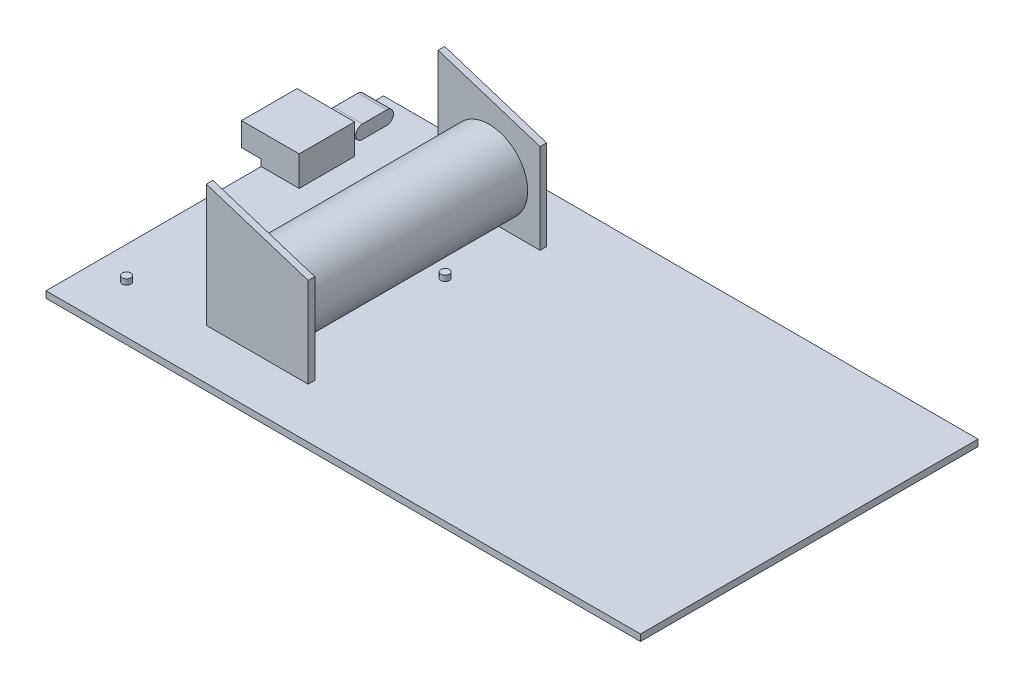
ISO-10303-21;
HEADER;
FILE_DESCRIPTION(('STEP AP214'),'2;1');
FILE_NAME('part.step','',(''),(''),'','','');
FILE_SCHEMA(('AUTOMOTIVE_DESIGN { 1 0 10303 214 1 1 1 1 }'));
ENDSEC;
DATA;
#1=APPLICATION_CONTEXT('core data for automotive mechanical design processes');
#2=APPLICATION_PROTOCOL_DEFINITION('international standard','automotive_design',2000,#1);
#3=PRODUCT_CONTEXT('',#1,'mechanical');
#4=PRODUCT('Part','Part','',(#3));
#5=PRODUCT_RELATED_PRODUCT_CATEGORY('part','',(#4));
#6=PRODUCT_DEFINITION_FORMATION('','',#4);
#7=PRODUCT_DEFINITION_CONTEXT('part definition',#1,'design');
#8=PRODUCT_DEFINITION('design','',#6,#7);
#9=PRODUCT_DEFINITION_SHAPE('','',#8);
#10=(LENGTH_UNIT() NAMED_UNIT(*) SI_UNIT(.MILLI.,.METRE.));
#11=(NAMED_UNIT(*) PLANE_ANGLE_UNIT() SI_UNIT($,.RADIAN.));
#12=(NAMED_UNIT(*) SI_UNIT($,.STERADIAN.) SOLID_ANGLE_UNIT());
#13=UNCERTAINTY_MEASURE_WITH_UNIT(LENGTH_MEASURE(1.E-05),#10,'distance_accuracy_value','');
#14=(GEOMETRIC_REPRESENTATION_CONTEXT(3) GLOBAL_UNCERTAINTY_ASSIGNED_CONTEXT((#13)) GLOBAL_UNIT_ASSIGNED_CONTEXT((#10,
#11,#12)) REPRESENTATION_CONTEXT('',''));
#15=CARTESIAN_POINT('',(0.,0.,0.));
#16=DIRECTION('',(0.,0.,1.));
#17=DIRECTION('',(1.,0.,0.));
#18=AXIS2_PLACEMENT_3D('',#15,#16,#17);
#19=CARTESIAN_POINT('',(0.,1.55,0.));
#20=DIRECTION('',(0.,-1.,0.));
#21=DIRECTION('',(0.,0.,-1.));
#22=AXIS2_PLACEMENT_3D('',#19,#20,#21);
#23=PLANE('',#22);
#24=CARTESIAN_POINT('',(-25.75,1.55,-9.9));
#25=DIRECTION('',(0.,-1.,0.));
#26=DIRECTION('',(0.,0.,-1.));
#27=AXIS2_PLACEMENT_3D('',#24,#25,#26);
#28=CIRCLE('',#27,0.999999999999998);
#29=CARTESIAN_POINT('',(-25.75,1.55,-10.9));
#30=VERTEX_POINT('',#29);
#31=EDGE_CURVE('E13',#30,#30,#28,.F.);
#32=ORIENTED_EDGE('',*,*,#31,.F.);
#33=EDGE_LOOP('',(#32));
#34=FACE_BOUND('',#33,.T.);
#35=CARTESIAN_POINT('',(-62.75,1.55,28.6));
#36=DIRECTION('',(0.,-1.,0.));
#37=DIRECTION('',(0.,0.,-1.));
#38=AXIS2_PLACEMENT_3D('',#35,#36,#37);
#39=CIRCLE('',#38,0.999999999999998);
#40=CARTESIAN_POINT('',(-62.75,1.55,27.6));
#41=VERTEX_POINT('',#40);
#42=EDGE_CURVE('E74',#41,#41,#39,.F.);
#43=ORIENTED_EDGE('',*,*,#42,.F.);
#44=EDGE_LOOP('',(#43));
#45=FACE_BOUND('',#44,.T.);
#46=DIRECTION('',(0.,0.,1.));
#47=VECTOR('',#46,1.);
#48=CARTESIAN_POINT('',(-44.35,1.55,-26.85));
#49=LINE('',#48,#47);
#50=CARTESIAN_POINT('',(-44.35,1.55,-28.4));
#51=VERTEX_POINT('',#50);
#52=CARTESIAN_POINT('',(-44.35,1.55,-26.85));
#53=VERTEX_POINT('',#52);
#54=EDGE_CURVE('E247',#51,#53,#49,.T.);
#55=ORIENTED_EDGE('',*,*,#54,.F.);
#56=DIRECTION('',(-1.,0.,0.));
#57=VECTOR('',#56,1.);
#58=CARTESIAN_POINT('',(-44.35,1.55,-28.4));
#59=LINE('',#58,#57);
#60=CARTESIAN_POINT('',(-20.2,1.55,-28.4));
#61=VERTEX_POINT('',#60);
#62=EDGE_CURVE('E261',#61,#51,#59,.T.);
#63=ORIENTED_EDGE('',*,*,#62,.F.);
#64=DIRECTION('',(0.,0.,-1.));
#65=VECTOR('',#64,1.);
#66=CARTESIAN_POINT('',(-20.2,1.55,-26.85));
#67=LINE('',#66,#65);
#68=CARTESIAN_POINT('',(-20.2,1.55,-26.85));
#69=VERTEX_POINT('',#68);
#70=EDGE_CURVE('E266',#69,#61,#67,.T.);
#71=ORIENTED_EDGE('',*,*,#70,.F.);
#72=DIRECTION('',(1.,0.,0.));
#73=VECTOR('',#72,1.);
#74=CARTESIAN_POINT('',(-44.35,1.55,-26.85));
#75=LINE('',#74,#73);
#76=EDGE_CURVE('E252',#53,#69,#75,.T.);
#77=ORIENTED_EDGE('',*,*,#76,.F.);
#78=EDGE_LOOP('',(#55,#63,#71,#77));
#79=FACE_BOUND('',#78,.T.);
#80=DIRECTION('',(0.,0.,1.));
#81=VECTOR('',#80,1.);
#82=CARTESIAN_POINT('',(-61.45,1.55,0.));
#83=LINE('',#82,#81);
#84=CARTESIAN_POINT('',(-61.45,1.55,-24.15));
#85=VERTEX_POINT('',#84);
#86=CARTESIAN_POINT('',(-61.45,1.55,-11.));
#87=VERTEX_POINT('',#86);
#88=EDGE_CURVE('E334',#85,#87,#83,.T.);
#89=ORIENTED_EDGE('',*,*,#88,.T.);
#90=DIRECTION('',(-1.,0.,0.));
#91=VECTOR('',#90,1.);
#92=CARTESIAN_POINT('',(0.,1.55,-11.));
#93=LINE('',#92,#91);
#94=CARTESIAN_POINT('',(-70.45,1.55,-11.));
#95=VERTEX_POINT('',#94);
#96=EDGE_CURVE('E330',#87,#95,#93,.T.);
#97=ORIENTED_EDGE('',*,*,#96,.T.);
#98=DIRECTION('',(0.,0.,1.));
#99=VECTOR('',#98,1.);
#100=CARTESIAN_POINT('',(-70.45,1.55,40.));
#101=LINE('',#100,#99);
#102=CARTESIAN_POINT('',(-70.45,1.55,40.));
#103=VERTEX_POINT('',#102);
#104=EDGE_CURVE('E388',#95,#103,#101,.T.);
#105=ORIENTED_EDGE('',*,*,#104,.T.);
#106=DIRECTION('',(1.,0.,0.));
#107=VECTOR('',#106,1.);
#108=CARTESIAN_POINT('',(-70.45,1.55,40.));
#109=LINE('',#108,#107);
#110=CARTESIAN_POINT('',(70.45,1.55,40.));
#111=VERTEX_POINT('',#110);
#112=EDGE_CURVE('E393',#103,#111,#109,.T.);
#113=ORIENTED_EDGE('',*,*,#112,.T.);
#114=DIRECTION('',(0.,0.,-1.));
#115=VECTOR('',#114,1.);
#116=CARTESIAN_POINT('',(70.45,1.55,40.));
#117=LINE('',#116,#115);
#118=CARTESIAN_POINT('',(70.45,1.55,-40.));
#119=VERTEX_POINT('',#118);
#120=EDGE_CURVE('E380',#111,#119,#117,.T.);
#121=ORIENTED_EDGE('',*,*,#120,.T.);
#122=DIRECTION('',(-1.,0.,0.));
#123=VECTOR('',#122,1.);
#124=CARTESIAN_POINT('',(-70.45,1.55,-40.));
#125=LINE('',#124,#123);
#126=CARTESIAN_POINT('',(-70.45,1.55,-40.));
#127=VERTEX_POINT('',#126);
#128=EDGE_CURVE('E384',#119,#127,#125,.T.);
#129=ORIENTED_EDGE('',*,*,#128,.T.);
#130=CARTESIAN_POINT('',(-70.45,1.55,-34.3));
#131=VERTEX_POINT('',#130);
#132=EDGE_CURVE('E389',#127,#131,#101,.T.);
#133=ORIENTED_EDGE('',*,*,#132,.T.);
#134=DIRECTION('',(1.,0.,0.));
#135=VECTOR('',#134,1.);
#136=CARTESIAN_POINT('',(-70.85,1.55,-34.3));
#137=LINE('',#136,#135);
#138=CARTESIAN_POINT('',(-64.,1.55,-34.3));
#139=VERTEX_POINT('',#138);
#140=EDGE_CURVE('E427',#139,#131,#137,.F.);
#141=ORIENTED_EDGE('',*,*,#140,.F.);
#142=DIRECTION('',(0.,0.,1.));
#143=VECTOR('',#142,1.);
#144=CARTESIAN_POINT('',(-64.,1.55,-34.3));
#145=LINE('',#144,#143);
#146=CARTESIAN_POINT('',(-64.,1.55,-28.56));
#147=VERTEX_POINT('',#146);
#148=EDGE_CURVE('E341',#139,#147,#145,.T.);
#149=ORIENTED_EDGE('',*,*,#148,.T.);
#150=DIRECTION('',(1.,0.,0.));
#151=VECTOR('',#150,1.);
#152=CARTESIAN_POINT('',(-70.85,1.55,-28.56));
#153=LINE('',#152,#151);
#154=CARTESIAN_POINT('',(-70.45,1.55,-28.56));
#155=VERTEX_POINT('',#154);
#156=EDGE_CURVE('E424',#147,#155,#153,.F.);
#157=ORIENTED_EDGE('',*,*,#156,.T.);
#158=CARTESIAN_POINT('',(-70.45,1.55,-24.15));
#159=VERTEX_POINT('',#158);
#160=EDGE_CURVE('E629',#155,#159,#101,.T.);
#161=ORIENTED_EDGE('',*,*,#160,.T.);
#162=DIRECTION('',(1.,0.,0.));
#163=VECTOR('',#162,1.);
#164=CARTESIAN_POINT('',(0.,1.55,-24.15));
#165=LINE('',#164,#163);
#166=EDGE_CURVE('E319',#159,#85,#165,.T.);
#167=ORIENTED_EDGE('',*,*,#166,.T.);
#168=EDGE_LOOP('',(#89,#97,#105,#113,#121,#129,#133,#141,#149,#157,#161,#167));
#169=FACE_BOUND('',#168,.T.);
#170=DIRECTION('',(0.,0.,1.));
#171=VECTOR('',#170,1.);
#172=CARTESIAN_POINT('',(-44.35,1.55,28.1));
#173=LINE('',#172,#171);
#174=CARTESIAN_POINT('',(-44.35,1.55,26.55));
#175=VERTEX_POINT('',#174);
#176=CARTESIAN_POINT('',(-44.35,1.55,28.1));
#177=VERTEX_POINT('',#176);
#178=EDGE_CURVE('E245',#175,#177,#173,.T.);
#179=ORIENTED_EDGE('',*,*,#178,.F.);
#180=DIRECTION('',(-1.,0.,0.));
#181=VECTOR('',#180,1.);
#182=CARTESIAN_POINT('',(-44.35,1.55,26.55));
#183=LINE('',#182,#181);
#184=CARTESIAN_POINT('',(-20.2,1.55,26.55));
#185=VERTEX_POINT('',#184);
#186=EDGE_CURVE('E234',#185,#175,#183,.T.);
#187=ORIENTED_EDGE('',*,*,#186,.F.);
#188=DIRECTION('',(0.,0.,-1.));
#189=VECTOR('',#188,1.);
#190=CARTESIAN_POINT('',(-20.2,1.55,28.1));
#191=LINE('',#190,#189);
#192=CARTESIAN_POINT('',(-20.2,1.55,28.1));
#193=VERTEX_POINT('',#192);
#194=EDGE_CURVE('E468',#193,#185,#191,.T.);
#195=ORIENTED_EDGE('',*,*,#194,.F.);
#196=DIRECTION('',(1.,0.,0.));
#197=VECTOR('',#196,1.);
#198=CARTESIAN_POINT('',(-44.35,1.55,28.1));
#199=LINE('',#198,#197);
#200=EDGE_CURVE('E81',#177,#193,#199,.T.);
#201=ORIENTED_EDGE('',*,*,#200,.F.);
#202=EDGE_LOOP('',(#179,#187,#195,#201));
#203=FACE_BOUND('',#202,.T.);
#204=ADVANCED_FACE('F65',(#34,#45,#79,#169,#203),#23,.F.);
#205=CARTESIAN_POINT('',(70.45,1.55,40.));
#206=DIRECTION('',(-1.,0.,0.));
#207=DIRECTION('',(0.,0.,1.));
#208=AXIS2_PLACEMENT_3D('',#205,#206,#207);
#209=PLANE('',#208);
#210=DIRECTION('',(0.,0.,-1.));
#211=VECTOR('',#210,1.);
#212=CARTESIAN_POINT('',(70.45,0.,40.));
#213=LINE('',#212,#211);
#214=CARTESIAN_POINT('',(70.45,0.,40.));
#215=VERTEX_POINT('',#214);
#216=CARTESIAN_POINT('',(70.45,0.,-40.));
#217=VERTEX_POINT('',#216);
#218=EDGE_CURVE('E379',#215,#217,#213,.T.);
#219=ORIENTED_EDGE('',*,*,#218,.T.);
#220=DIRECTION('',(0.,-1.,0.));
#221=VECTOR('',#220,1.);
#222=CARTESIAN_POINT('',(70.45,1.55,-40.));
#223=LINE('',#222,#221);
#224=EDGE_CURVE('E420',#119,#217,#223,.T.);
#225=ORIENTED_EDGE('',*,*,#224,.F.);
#226=ORIENTED_EDGE('',*,*,#120,.F.);
#227=DIRECTION('',(0.,-1.,0.));
#228=VECTOR('',#227,1.);
#229=CARTESIAN_POINT('',(70.45,1.55,40.));
#230=LINE('',#229,#228);
#231=EDGE_CURVE('E397',#111,#215,#230,.T.);
#232=ORIENTED_EDGE('',*,*,#231,.T.);
#233=EDGE_LOOP('',(#219,#225,#226,#232));
#234=FACE_BOUND('',#233,.T.);
#235=ADVANCED_FACE('F67',(#234),#209,.F.);
#236=CARTESIAN_POINT('',(-70.45,1.55,-40.));
#237=DIRECTION('',(0.,0.,1.));
#238=DIRECTION('',(1.,0.,0.));
#239=AXIS2_PLACEMENT_3D('',#236,#237,#238);
#240=PLANE('',#239);
#241=DIRECTION('',(-1.,0.,0.));
#242=VECTOR('',#241,1.);
#243=CARTESIAN_POINT('',(-70.45,0.,-40.));
#244=LINE('',#243,#242);
#245=CARTESIAN_POINT('',(-70.45,0.,-40.));
#246=VERTEX_POINT('',#245);
#247=EDGE_CURVE('E401',#217,#246,#244,.T.);
#248=ORIENTED_EDGE('',*,*,#247,.T.);
#249=DIRECTION('',(0.,-1.,0.));
#250=VECTOR('',#249,1.);
#251=CARTESIAN_POINT('',(-70.45,1.55,-40.));
#252=LINE('',#251,#250);
#253=EDGE_CURVE('E416',#127,#246,#252,.T.);
#254=ORIENTED_EDGE('',*,*,#253,.F.);
#255=ORIENTED_EDGE('',*,*,#128,.F.);
#256=ORIENTED_EDGE('',*,*,#224,.T.);
#257=EDGE_LOOP('',(#248,#254,#255,#256));
#258=FACE_BOUND('',#257,.T.);
#259=ADVANCED_FACE('F609',(#258),#240,.F.);
#260=CARTESIAN_POINT('',(-70.45,1.55,40.));
#261=DIRECTION('',(1.,0.,0.));
#262=DIRECTION('',(0.,0.,-1.));
#263=AXIS2_PLACEMENT_3D('',#260,#261,#262);
#264=PLANE('',#263);
#265=DIRECTION('',(0.,-1.,0.));
#266=VECTOR('',#265,1.);
#267=CARTESIAN_POINT('',(-70.45,0.,-24.15));
#268=LINE('',#267,#266);
#269=CARTESIAN_POINT('',(-70.45,3.1,-24.15));
#270=VERTEX_POINT('',#269);
#271=EDGE_CURVE('E434',#270,#159,#268,.T.);
#272=ORIENTED_EDGE('',*,*,#271,.T.);
#273=ORIENTED_EDGE('',*,*,#160,.F.);
#274=EDGE_CURVE('E394',#131,#155,#101,.T.);
#275=ORIENTED_EDGE('',*,*,#274,.F.);
#276=ORIENTED_EDGE('',*,*,#132,.F.);
#277=ORIENTED_EDGE('',*,*,#253,.T.);
#278=DIRECTION('',(0.,0.,1.));
#279=VECTOR('',#278,1.);
#280=CARTESIAN_POINT('',(-70.45,0.,40.));
#281=LINE('',#280,#279);
#282=CARTESIAN_POINT('',(-70.45,0.,40.));
#283=VERTEX_POINT('',#282);
#284=EDGE_CURVE('E404',#246,#283,#281,.T.);
#285=ORIENTED_EDGE('',*,*,#284,.T.);
#286=DIRECTION('',(0.,-1.,0.));
#287=VECTOR('',#286,1.);
#288=CARTESIAN_POINT('',(-70.45,1.55,40.));
#289=LINE('',#288,#287);
#290=EDGE_CURVE('E412',#103,#283,#289,.T.);
#291=ORIENTED_EDGE('',*,*,#290,.F.);
#292=ORIENTED_EDGE('',*,*,#104,.F.);
#293=DIRECTION('',(0.,1.,0.));
#294=VECTOR('',#293,1.);
#295=CARTESIAN_POINT('',(-70.45,0.,-11.));
#296=LINE('',#295,#294);
#297=CARTESIAN_POINT('',(-70.45,3.1,-11.));
#298=VERTEX_POINT('',#297);
#299=EDGE_CURVE('E286',#95,#298,#296,.T.);
#300=ORIENTED_EDGE('',*,*,#299,.T.);
#301=DIRECTION('',(0.,0.,1.));
#302=VECTOR('',#301,1.);
#303=CARTESIAN_POINT('',(-70.45,3.1,-25.1));
#304=LINE('',#303,#302);
#305=EDGE_CURVE('E293',#270,#298,#304,.T.);
#306=ORIENTED_EDGE('',*,*,#305,.F.);
#307=EDGE_LOOP('',(#272,#273,#275,#276,#277,#285,#291,#292,#300,#306));
#308=FACE_BOUND('',#307,.T.);
#309=ADVANCED_FACE('F606',(#308),#264,.F.);
#310=CARTESIAN_POINT('',(-70.45,1.55,40.));
#311=DIRECTION('',(0.,0.,-1.));
#312=DIRECTION('',(-1.,0.,0.));
#313=AXIS2_PLACEMENT_3D('',#310,#311,#312);
#314=PLANE('',#313);
#315=DIRECTION('',(1.,0.,0.));
#316=VECTOR('',#315,1.);
#317=CARTESIAN_POINT('',(-70.45,0.,40.));
#318=LINE('',#317,#316);
#319=EDGE_CURVE('E385',#283,#215,#318,.T.);
#320=ORIENTED_EDGE('',*,*,#319,.T.);
#321=ORIENTED_EDGE('',*,*,#231,.F.);
#322=ORIENTED_EDGE('',*,*,#112,.F.);
#323=ORIENTED_EDGE('',*,*,#290,.T.);
#324=EDGE_LOOP('',(#320,#321,#322,#323));
#325=FACE_BOUND('',#324,.T.);
#326=ADVANCED_FACE('F602',(#325),#314,.F.);
#327=CARTESIAN_POINT('',(0.,0.,0.));
#328=DIRECTION('',(0.,-1.,0.));
#329=DIRECTION('',(0.,0.,-1.));
#330=AXIS2_PLACEMENT_3D('',#327,#328,#329);
#331=PLANE('',#330);
#332=ORIENTED_EDGE('',*,*,#319,.F.);
#333=ORIENTED_EDGE('',*,*,#284,.F.);
#334=ORIENTED_EDGE('',*,*,#247,.F.);
#335=ORIENTED_EDGE('',*,*,#218,.F.);
#336=EDGE_LOOP('',(#332,#333,#334,#335));
#337=FACE_BOUND('',#336,.T.);
#338=ADVANCED_FACE('F595',(#337),#331,.T.);
#339=CARTESIAN_POINT('',(-70.85,1.55,-34.3));
#340=DIRECTION('',(0.,1.,0.));
#341=DIRECTION('',(0.,0.,1.));
#342=AXIS2_PLACEMENT_3D('',#339,#340,#341);
#343=PLANE('',#342);
#344=DIRECTION('',(1.,0.,0.));
#345=VECTOR('',#344,1.);
#346=CARTESIAN_POINT('',(-70.85,1.55,-34.3));
#347=LINE('',#346,#345);
#348=CARTESIAN_POINT('',(-70.85,1.55,-34.3));
#349=VERTEX_POINT('',#348);
#350=EDGE_CURVE('E375',#349,#131,#347,.T.);
#351=ORIENTED_EDGE('',*,*,#350,.T.);
#352=ORIENTED_EDGE('',*,*,#274,.T.);
#353=DIRECTION('',(1.,0.,0.));
#354=VECTOR('',#353,1.);
#355=CARTESIAN_POINT('',(-70.85,1.55,-28.56));
#356=LINE('',#355,#354);
#357=CARTESIAN_POINT('',(-70.85,1.55,-28.56));
#358=VERTEX_POINT('',#357);
#359=EDGE_CURVE('E371',#358,#155,#356,.T.);
#360=ORIENTED_EDGE('',*,*,#359,.F.);
#361=DIRECTION('',(0.,0.,1.));
#362=VECTOR('',#361,1.);
#363=CARTESIAN_POINT('',(-70.85,1.55,-34.3));
#364=LINE('',#363,#362);
#365=EDGE_CURVE('E356',#349,#358,#364,.T.);
#366=ORIENTED_EDGE('',*,*,#365,.F.);
#367=EDGE_LOOP('',(#351,#352,#360,#366));
#368=FACE_BOUND('',#367,.T.);
#369=ADVANCED_FACE('F592',(#368),#343,.F.);
#370=CARTESIAN_POINT('',(-70.85,3.15,-34.3));
#371=DIRECTION('',(1.,0.,0.));
#372=DIRECTION('',(0.,0.,-1.));
#373=AXIS2_PLACEMENT_3D('',#370,#371,#372);
#374=CYLINDRICAL_SURFACE('',#373,1.6);
#375=DIRECTION('',(1.,0.,0.));
#376=VECTOR('',#375,1.);
#377=CARTESIAN_POINT('',(-70.85,4.75,-34.3));
#378=LINE('',#377,#376);
#379=CARTESIAN_POINT('',(-70.85,4.75,-34.3));
#380=VERTEX_POINT('',#379);
#381=CARTESIAN_POINT('',(-64.,4.75,-34.3));
#382=VERTEX_POINT('',#381);
#383=EDGE_CURVE('E365',#380,#382,#378,.T.);
#384=ORIENTED_EDGE('',*,*,#383,.T.);
#385=CARTESIAN_POINT('',(-64.,3.15,-34.3));
#386=DIRECTION('',(-1.,0.,0.));
#387=DIRECTION('',(0.,0.,1.));
#388=AXIS2_PLACEMENT_3D('',#385,#386,#387);
#389=CIRCLE('',#388,1.6);
#390=EDGE_CURVE('E337',#382,#139,#389,.T.);
#391=ORIENTED_EDGE('',*,*,#390,.T.);
#392=ORIENTED_EDGE('',*,*,#140,.T.);
#393=ORIENTED_EDGE('',*,*,#350,.F.);
#394=CARTESIAN_POINT('',(-70.85,3.15,-34.3));
#395=DIRECTION('',(-1.,0.,0.));
#396=DIRECTION('',(0.,0.,1.));
#397=AXIS2_PLACEMENT_3D('',#394,#395,#396);
#398=CIRCLE('',#397,1.6);
#399=EDGE_CURVE('E352',#380,#349,#398,.T.);
#400=ORIENTED_EDGE('',*,*,#399,.F.);
#401=EDGE_LOOP('',(#384,#391,#392,#393,#400));
#402=FACE_BOUND('',#401,.T.);
#403=ADVANCED_FACE('F590',(#402),#374,.T.);
#404=CARTESIAN_POINT('',(-70.85,3.15,-28.56));
#405=DIRECTION('',(1.,0.,0.));
#406=DIRECTION('',(0.,0.,-1.));
#407=AXIS2_PLACEMENT_3D('',#404,#405,#406);
#408=CYLINDRICAL_SURFACE('',#407,1.6);
#409=ORIENTED_EDGE('',*,*,#359,.T.);
#410=ORIENTED_EDGE('',*,*,#156,.F.);
#411=CARTESIAN_POINT('',(-64.,3.15,-28.56));
#412=DIRECTION('',(-1.,0.,0.));
#413=DIRECTION('',(0.,0.,1.));
#414=AXIS2_PLACEMENT_3D('',#411,#412,#413);
#415=CIRCLE('',#414,1.6);
#416=CARTESIAN_POINT('',(-64.,4.75,-28.56));
#417=VERTEX_POINT('',#416);
#418=EDGE_CURVE('E344',#147,#417,#415,.T.);
#419=ORIENTED_EDGE('',*,*,#418,.T.);
#420=DIRECTION('',(1.,0.,0.));
#421=VECTOR('',#420,1.);
#422=CARTESIAN_POINT('',(-70.85,4.75,-28.56));
#423=LINE('',#422,#421);
#424=CARTESIAN_POINT('',(-70.85,4.75,-28.56));
#425=VERTEX_POINT('',#424);
#426=EDGE_CURVE('E368',#425,#417,#423,.T.);
#427=ORIENTED_EDGE('',*,*,#426,.F.);
#428=CARTESIAN_POINT('',(-70.85,3.15,-28.56));
#429=DIRECTION('',(-1.,0.,0.));
#430=DIRECTION('',(0.,0.,1.));
#431=AXIS2_PLACEMENT_3D('',#428,#429,#430);
#432=CIRCLE('',#431,1.6);
#433=EDGE_CURVE('E359',#358,#425,#432,.T.);
#434=ORIENTED_EDGE('',*,*,#433,.F.);
#435=EDGE_LOOP('',(#409,#410,#419,#427,#434));
#436=FACE_BOUND('',#435,.T.);
#437=ADVANCED_FACE('F586',(#436),#408,.T.);
#438=CARTESIAN_POINT('',(-70.85,4.75,-34.3));
#439=DIRECTION('',(0.,-1.,0.));
#440=DIRECTION('',(0.,0.,-1.));
#441=AXIS2_PLACEMENT_3D('',#438,#439,#440);
#442=PLANE('',#441);
#443=ORIENTED_EDGE('',*,*,#426,.T.);
#444=DIRECTION('',(0.,0.,-1.));
#445=VECTOR('',#444,1.);
#446=CARTESIAN_POINT('',(-64.,4.75,-34.3));
#447=LINE('',#446,#445);
#448=EDGE_CURVE('E348',#417,#382,#447,.T.);
#449=ORIENTED_EDGE('',*,*,#448,.T.);
#450=ORIENTED_EDGE('',*,*,#383,.F.);
#451=DIRECTION('',(0.,0.,-1.));
#452=VECTOR('',#451,1.);
#453=CARTESIAN_POINT('',(-70.85,4.75,-34.3));
#454=LINE('',#453,#452);
#455=EDGE_CURVE('E362',#425,#380,#454,.T.);
#456=ORIENTED_EDGE('',*,*,#455,.F.);
#457=EDGE_LOOP('',(#443,#449,#450,#456));
#458=FACE_BOUND('',#457,.T.);
#459=ADVANCED_FACE('F582',(#458),#442,.F.);
#460=CARTESIAN_POINT('',(-70.85,3.15,-34.3));
#461=DIRECTION('',(-1.,0.,0.));
#462=DIRECTION('',(0.,0.,1.));
#463=AXIS2_PLACEMENT_3D('',#460,#461,#462);
#464=PLANE('',#463);
#465=ORIENTED_EDGE('',*,*,#399,.T.);
#466=ORIENTED_EDGE('',*,*,#365,.T.);
#467=ORIENTED_EDGE('',*,*,#433,.T.);
#468=ORIENTED_EDGE('',*,*,#455,.T.);
#469=EDGE_LOOP('',(#465,#466,#467,#468));
#470=FACE_BOUND('',#469,.T.);
#471=ADVANCED_FACE('F578',(#470),#464,.T.);
#472=CARTESIAN_POINT('',(-64.,3.15,-34.3));
#473=DIRECTION('',(-1.,0.,0.));
#474=DIRECTION('',(0.,0.,1.));
#475=AXIS2_PLACEMENT_3D('',#472,#473,#474);
#476=PLANE('',#475);
#477=ORIENTED_EDGE('',*,*,#390,.F.);
#478=ORIENTED_EDGE('',*,*,#448,.F.);
#479=ORIENTED_EDGE('',*,*,#418,.F.);
#480=ORIENTED_EDGE('',*,*,#148,.F.);
#481=EDGE_LOOP('',(#477,#478,#479,#480));
#482=FACE_BOUND('',#481,.T.);
#483=ADVANCED_FACE('F574',(#482),#476,.F.);
#484=CARTESIAN_POINT('',(-61.45,0.,-11.));
#485=DIRECTION('',(1.,0.,0.));
#486=DIRECTION('',(0.,0.,-1.));
#487=AXIS2_PLACEMENT_3D('',#484,#485,#486);
#488=PLANE('',#487);
#489=ORIENTED_EDGE('',*,*,#88,.F.);
#490=DIRECTION('',(0.,1.,0.));
#491=VECTOR('',#490,1.);
#492=CARTESIAN_POINT('',(-61.45,0.,-24.15));
#493=LINE('',#492,#491);
#494=CARTESIAN_POINT('',(-61.45,8.65,-24.15));
#495=VERTEX_POINT('',#494);
#496=EDGE_CURVE('E315',#85,#495,#493,.T.);
#497=ORIENTED_EDGE('',*,*,#496,.T.);
#498=DIRECTION('',(0.,0.,-1.));
#499=VECTOR('',#498,1.);
#500=CARTESIAN_POINT('',(-61.45,8.65,-11.));
#501=LINE('',#500,#499);
#502=CARTESIAN_POINT('',(-61.45,8.65,-11.));
#503=VERTEX_POINT('',#502);
#504=EDGE_CURVE('E299',#503,#495,#501,.T.);
#505=ORIENTED_EDGE('',*,*,#504,.F.);
#506=DIRECTION('',(0.,1.,0.));
#507=VECTOR('',#506,1.);
#508=CARTESIAN_POINT('',(-61.45,0.,-11.));
#509=LINE('',#508,#507);
#510=EDGE_CURVE('E316',#87,#503,#509,.T.);
#511=ORIENTED_EDGE('',*,*,#510,.F.);
#512=EDGE_LOOP('',(#489,#497,#505,#511));
#513=FACE_BOUND('',#512,.T.);
#514=ADVANCED_FACE('F564',(#513),#488,.T.);
#515=CARTESIAN_POINT('',(-61.45,0.,-11.));
#516=DIRECTION('',(0.,0.,1.));
#517=DIRECTION('',(1.,0.,0.));
#518=AXIS2_PLACEMENT_3D('',#515,#516,#517);
#519=PLANE('',#518);
#520=ORIENTED_EDGE('',*,*,#299,.F.);
#521=ORIENTED_EDGE('',*,*,#96,.F.);
#522=ORIENTED_EDGE('',*,*,#510,.T.);
#523=DIRECTION('',(1.,0.,0.));
#524=VECTOR('',#523,1.);
#525=CARTESIAN_POINT('',(-61.45,8.65,-11.));
#526=LINE('',#525,#524);
#527=CARTESIAN_POINT('',(-75.1,8.65,-11.));
#528=VERTEX_POINT('',#527);
#529=EDGE_CURVE('E311',#528,#503,#526,.T.);
#530=ORIENTED_EDGE('',*,*,#529,.F.);
#531=DIRECTION('',(0.,1.,0.));
#532=VECTOR('',#531,1.);
#533=CARTESIAN_POINT('',(-75.1,0.,-11.));
#534=LINE('',#533,#532);
#535=CARTESIAN_POINT('',(-75.1,3.1,-11.));
#536=VERTEX_POINT('',#535);
#537=EDGE_CURVE('E320',#536,#528,#534,.T.);
#538=ORIENTED_EDGE('',*,*,#537,.F.);
#539=DIRECTION('',(-1.,0.,0.));
#540=VECTOR('',#539,1.);
#541=CARTESIAN_POINT('',(-70.45,3.1,-11.));
#542=LINE('',#541,#540);
#543=EDGE_CURVE('E290',#298,#536,#542,.T.);
#544=ORIENTED_EDGE('',*,*,#543,.F.);
#545=EDGE_LOOP('',(#520,#521,#522,#530,#538,#544));
#546=FACE_BOUND('',#545,.T.);
#547=ADVANCED_FACE('F560',(#546),#519,.T.);
#548=CARTESIAN_POINT('',(-61.45,0.,-24.15));
#549=DIRECTION('',(0.,0.,-1.));
#550=DIRECTION('',(-1.,0.,0.));
#551=AXIS2_PLACEMENT_3D('',#548,#549,#550);
#552=PLANE('',#551);
#553=ORIENTED_EDGE('',*,*,#271,.F.);
#554=DIRECTION('',(1.,0.,0.));
#555=VECTOR('',#554,1.);
#556=CARTESIAN_POINT('',(-61.45,3.1,-24.15));
#557=LINE('',#556,#555);
#558=CARTESIAN_POINT('',(-75.1,3.1,-24.15));
#559=VERTEX_POINT('',#558);
#560=EDGE_CURVE('E296',#559,#270,#557,.T.);
#561=ORIENTED_EDGE('',*,*,#560,.F.);
#562=DIRECTION('',(0.,1.,0.));
#563=VECTOR('',#562,1.);
#564=CARTESIAN_POINT('',(-75.1,0.,-24.15));
#565=LINE('',#564,#563);
#566=CARTESIAN_POINT('',(-75.1,8.65,-24.15));
#567=VERTEX_POINT('',#566);
#568=EDGE_CURVE('E323',#559,#567,#565,.T.);
#569=ORIENTED_EDGE('',*,*,#568,.T.);
#570=DIRECTION('',(-1.,0.,0.));
#571=VECTOR('',#570,1.);
#572=CARTESIAN_POINT('',(-61.45,8.65,-24.15));
#573=LINE('',#572,#571);
#574=EDGE_CURVE('E303',#495,#567,#573,.T.);
#575=ORIENTED_EDGE('',*,*,#574,.F.);
#576=ORIENTED_EDGE('',*,*,#496,.F.);
#577=ORIENTED_EDGE('',*,*,#166,.F.);
#578=EDGE_LOOP('',(#553,#561,#569,#575,#576,#577));
#579=FACE_BOUND('',#578,.T.);
#580=ADVANCED_FACE('F563',(#579),#552,.T.);
#581=CARTESIAN_POINT('',(-75.1,0.,-11.));
#582=DIRECTION('',(-1.,0.,0.));
#583=DIRECTION('',(0.,0.,1.));
#584=AXIS2_PLACEMENT_3D('',#581,#582,#583);
#585=PLANE('',#584);
#586=DIRECTION('',(0.,0.,-1.));
#587=VECTOR('',#586,1.);
#588=CARTESIAN_POINT('',(-75.1,3.1,-11.));
#589=LINE('',#588,#587);
#590=EDGE_CURVE('E431',#536,#559,#589,.T.);
#591=ORIENTED_EDGE('',*,*,#590,.F.);
#592=ORIENTED_EDGE('',*,*,#537,.T.);
#593=DIRECTION('',(0.,0.,1.));
#594=VECTOR('',#593,1.);
#595=CARTESIAN_POINT('',(-75.1,8.65,-11.));
#596=LINE('',#595,#594);
#597=EDGE_CURVE('E307',#567,#528,#596,.T.);
#598=ORIENTED_EDGE('',*,*,#597,.F.);
#599=ORIENTED_EDGE('',*,*,#568,.F.);
#600=EDGE_LOOP('',(#591,#592,#598,#599));
#601=FACE_BOUND('',#600,.T.);
#602=ADVANCED_FACE('F558',(#601),#585,.T.);
#603=CARTESIAN_POINT('',(0.,8.65,0.));
#604=DIRECTION('',(0.,1.,0.));
#605=DIRECTION('',(0.,0.,1.));
#606=AXIS2_PLACEMENT_3D('',#603,#604,#605);
#607=PLANE('',#606);
#608=ORIENTED_EDGE('',*,*,#504,.T.);
#609=ORIENTED_EDGE('',*,*,#574,.T.);
#610=ORIENTED_EDGE('',*,*,#597,.T.);
#611=ORIENTED_EDGE('',*,*,#529,.T.);
#612=EDGE_LOOP('',(#608,#609,#610,#611));
#613=FACE_BOUND('',#612,.T.);
#614=ADVANCED_FACE('F554',(#613),#607,.T.);
#615=CARTESIAN_POINT('',(-70.45,3.1,-25.1));
#616=DIRECTION('',(0.,1.,0.));
#617=DIRECTION('',(-1.,0.,0.));
#618=AXIS2_PLACEMENT_3D('',#615,#616,#617);
#619=PLANE('',#618);
#620=ORIENTED_EDGE('',*,*,#560,.T.);
#621=ORIENTED_EDGE('',*,*,#305,.T.);
#622=ORIENTED_EDGE('',*,*,#543,.T.);
#623=ORIENTED_EDGE('',*,*,#590,.T.);
#624=EDGE_LOOP('',(#620,#621,#622,#623));
#625=FACE_BOUND('',#624,.T.);
#626=ADVANCED_FACE('F550',(#625),#619,.F.);
#627=CARTESIAN_POINT('',(-44.35,30.55,-26.85));
#628=DIRECTION('',(1.,0.,0.));
#629=DIRECTION('',(0.,0.,-1.));
#630=AXIS2_PLACEMENT_3D('',#627,#628,#629);
#631=PLANE('',#630);
#632=ORIENTED_EDGE('',*,*,#54,.T.);
#633=DIRECTION('',(0.,-1.,0.));
#634=VECTOR('',#633,1.);
#635=CARTESIAN_POINT('',(-44.35,30.55,-26.85));
#636=LINE('',#635,#634);
#637=CARTESIAN_POINT('',(-44.35,30.55,-26.85));
#638=VERTEX_POINT('',#637);
#639=EDGE_CURVE('E282',#638,#53,#636,.T.);
#640=ORIENTED_EDGE('',*,*,#639,.F.);
#641=DIRECTION('',(0.,0.,1.));
#642=VECTOR('',#641,1.);
#643=CARTESIAN_POINT('',(-44.35,30.55,-26.85));
#644=LINE('',#643,#642);
#645=CARTESIAN_POINT('',(-44.35,30.55,-28.4));
#646=VERTEX_POINT('',#645);
#647=EDGE_CURVE('E258',#646,#638,#644,.T.);
#648=ORIENTED_EDGE('',*,*,#647,.F.);
#649=DIRECTION('',(0.,-1.,0.));
#650=VECTOR('',#649,1.);
#651=CARTESIAN_POINT('',(-44.35,30.55,-28.4));
#652=LINE('',#651,#650);
#653=EDGE_CURVE('E260',#646,#51,#652,.T.);
#654=ORIENTED_EDGE('',*,*,#653,.T.);
#655=EDGE_LOOP('',(#632,#640,#648,#654));
#656=FACE_BOUND('',#655,.T.);
#657=ADVANCED_FACE('F546',(#656),#631,.F.);
#658=CARTESIAN_POINT('',(-44.35,30.55,-26.85));
#659=DIRECTION('',(0.,0.,-1.));
#660=DIRECTION('',(-1.,0.,0.));
#661=AXIS2_PLACEMENT_3D('',#658,#659,#660);
#662=PLANE('',#661);
#663=CARTESIAN_POINT('',(-32.275,12.25,-26.85));
#664=DIRECTION('',(0.,0.,-1.));
#665=DIRECTION('',(-1.,0.,0.));
#666=AXIS2_PLACEMENT_3D('',#663,#664,#665);
#667=CIRCLE('',#666,9.15);
#668=CARTESIAN_POINT('',(-41.425,12.25,-26.85));
#669=VERTEX_POINT('',#668);
#670=EDGE_CURVE('E442',#669,#669,#667,.F.);
#671=ORIENTED_EDGE('',*,*,#670,.F.);
#672=EDGE_LOOP('',(#671));
#673=FACE_BOUND('',#672,.T.);
#674=DIRECTION('',(0.,-1.,0.));
#675=VECTOR('',#674,1.);
#676=CARTESIAN_POINT('',(-20.2,30.55,-26.85));
#677=LINE('',#676,#675);
#678=CARTESIAN_POINT('',(-20.2,22.85,-26.85));
#679=VERTEX_POINT('',#678);
#680=EDGE_CURVE('E279',#679,#69,#677,.T.);
#681=ORIENTED_EDGE('',*,*,#680,.F.);
#682=DIRECTION('',(-0.952744267711339,0.303773534632601,0.));
#683=VECTOR('',#682,1.);
#684=CARTESIAN_POINT('',(-44.35,30.55,-26.85));
#685=LINE('',#684,#683);
#686=EDGE_CURVE('E462',#679,#638,#685,.T.);
#687=ORIENTED_EDGE('',*,*,#686,.T.);
#688=ORIENTED_EDGE('',*,*,#639,.T.);
#689=ORIENTED_EDGE('',*,*,#76,.T.);
#690=EDGE_LOOP('',(#681,#687,#688,#689));
#691=FACE_BOUND('',#690,.T.);
#692=ADVANCED_FACE('F542',(#673,#691),#662,.F.);
#693=CARTESIAN_POINT('',(-20.2,30.55,-26.85));
#694=DIRECTION('',(-1.,0.,0.));
#695=DIRECTION('',(0.,0.,1.));
#696=AXIS2_PLACEMENT_3D('',#693,#694,#695);
#697=PLANE('',#696);
#698=DIRECTION('',(0.,-1.,0.));
#699=VECTOR('',#698,1.);
#700=CARTESIAN_POINT('',(-20.2,30.55,-28.4));
#701=LINE('',#700,#699);
#702=CARTESIAN_POINT('',(-20.2,22.85,-28.4));
#703=VERTEX_POINT('',#702);
#704=EDGE_CURVE('E276',#703,#61,#701,.T.);
#705=ORIENTED_EDGE('',*,*,#704,.F.);
#706=DIRECTION('',(0.,0.,1.));
#707=VECTOR('',#706,1.);
#708=CARTESIAN_POINT('',(-20.2,22.85,-60.9));
#709=LINE('',#708,#707);
#710=EDGE_CURVE('E487',#703,#679,#709,.T.);
#711=ORIENTED_EDGE('',*,*,#710,.T.);
#712=ORIENTED_EDGE('',*,*,#680,.T.);
#713=ORIENTED_EDGE('',*,*,#70,.T.);
#714=EDGE_LOOP('',(#705,#711,#712,#713));
#715=FACE_BOUND('',#714,.T.);
#716=ADVANCED_FACE('F538',(#715),#697,.F.);
#717=CARTESIAN_POINT('',(-44.35,30.55,-28.4));
#718=DIRECTION('',(0.,0.,1.));
#719=DIRECTION('',(1.,0.,0.));
#720=AXIS2_PLACEMENT_3D('',#717,#718,#719);
#721=PLANE('',#720);
#722=ORIENTED_EDGE('',*,*,#653,.F.);
#723=DIRECTION('',(0.952744267711339,-0.303773534632601,0.));
#724=VECTOR('',#723,1.);
#725=CARTESIAN_POINT('',(-44.35,30.55,-28.4));
#726=LINE('',#725,#724);
#727=EDGE_CURVE('E481',#646,#703,#726,.T.);
#728=ORIENTED_EDGE('',*,*,#727,.T.);
#729=ORIENTED_EDGE('',*,*,#704,.T.);
#730=ORIENTED_EDGE('',*,*,#62,.T.);
#731=EDGE_LOOP('',(#722,#728,#729,#730));
#732=FACE_BOUND('',#731,.T.);
#733=ADVANCED_FACE('F535',(#732),#721,.F.);
#734=CARTESIAN_POINT('',(-44.35,30.55,28.1));
#735=DIRECTION('',(1.,0.,0.));
#736=DIRECTION('',(0.,0.,-1.));
#737=AXIS2_PLACEMENT_3D('',#734,#735,#736);
#738=PLANE('',#737);
#739=ORIENTED_EDGE('',*,*,#178,.T.);
#740=DIRECTION('',(0.,-1.,0.));
#741=VECTOR('',#740,1.);
#742=CARTESIAN_POINT('',(-44.35,30.55,28.1));
#743=LINE('',#742,#741);
#744=CARTESIAN_POINT('',(-44.35,30.55,28.1));
#745=VERTEX_POINT('',#744);
#746=EDGE_CURVE('E238',#745,#177,#743,.T.);
#747=ORIENTED_EDGE('',*,*,#746,.F.);
#748=DIRECTION('',(0.,0.,1.));
#749=VECTOR('',#748,1.);
#750=CARTESIAN_POINT('',(-44.35,30.55,28.1));
#751=LINE('',#750,#749);
#752=CARTESIAN_POINT('',(-44.35,30.55,26.55));
#753=VERTEX_POINT('',#752);
#754=EDGE_CURVE('E222',#753,#745,#751,.T.);
#755=ORIENTED_EDGE('',*,*,#754,.F.);
#756=DIRECTION('',(0.,-1.,0.));
#757=VECTOR('',#756,1.);
#758=CARTESIAN_POINT('',(-44.35,30.55,26.55));
#759=LINE('',#758,#757);
#760=EDGE_CURVE('E233',#753,#175,#759,.T.);
#761=ORIENTED_EDGE('',*,*,#760,.T.);
#762=EDGE_LOOP('',(#739,#747,#755,#761));
#763=FACE_BOUND('',#762,.T.);
#764=ADVANCED_FACE('F244',(#763),#738,.F.);
#765=CARTESIAN_POINT('',(-44.35,30.55,28.1));
#766=DIRECTION('',(0.,0.,-1.));
#767=DIRECTION('',(-1.,0.,0.));
#768=AXIS2_PLACEMENT_3D('',#765,#766,#767);
#769=PLANE('',#768);
#770=DIRECTION('',(0.,-1.,0.));
#771=VECTOR('',#770,1.);
#772=CARTESIAN_POINT('',(-20.2,30.55,28.1));
#773=LINE('',#772,#771);
#774=CARTESIAN_POINT('',(-20.2,22.85,28.1));
#775=VERTEX_POINT('',#774);
#776=EDGE_CURVE('E89',#775,#193,#773,.T.);
#777=ORIENTED_EDGE('',*,*,#776,.F.);
#778=DIRECTION('',(0.952744267711339,-0.303773534632601,0.));
#779=VECTOR('',#778,1.);
#780=CARTESIAN_POINT('',(-44.35,30.55,28.1));
#781=LINE('',#780,#779);
#782=EDGE_CURVE('E225',#745,#775,#781,.T.);
#783=ORIENTED_EDGE('',*,*,#782,.F.);
#784=ORIENTED_EDGE('',*,*,#746,.T.);
#785=ORIENTED_EDGE('',*,*,#200,.T.);
#786=EDGE_LOOP('',(#777,#783,#784,#785));
#787=FACE_BOUND('',#786,.T.);
#788=ADVANCED_FACE('F237',(#787),#769,.F.);
#789=CARTESIAN_POINT('',(-20.2,30.55,28.1));
#790=DIRECTION('',(-1.,0.,0.));
#791=DIRECTION('',(0.,0.,1.));
#792=AXIS2_PLACEMENT_3D('',#789,#790,#791);
#793=PLANE('',#792);
#794=DIRECTION('',(0.,-1.,0.));
#795=VECTOR('',#794,1.);
#796=CARTESIAN_POINT('',(-20.2,30.55,26.55));
#797=LINE('',#796,#795);
#798=CARTESIAN_POINT('',(-20.2,22.85,26.55));
#799=VERTEX_POINT('',#798);
#800=EDGE_CURVE('E254',#799,#185,#797,.T.);
#801=ORIENTED_EDGE('',*,*,#800,.F.);
#802=EDGE_CURVE('E241',#799,#775,#709,.T.);
#803=ORIENTED_EDGE('',*,*,#802,.T.);
#804=ORIENTED_EDGE('',*,*,#776,.T.);
#805=ORIENTED_EDGE('',*,*,#194,.T.);
#806=EDGE_LOOP('',(#801,#803,#804,#805));
#807=FACE_BOUND('',#806,.T.);
#808=ADVANCED_FACE('F527',(#807),#793,.F.);
#809=CARTESIAN_POINT('',(-44.35,30.55,26.55));
#810=DIRECTION('',(0.,0.,1.));
#811=DIRECTION('',(1.,0.,0.));
#812=AXIS2_PLACEMENT_3D('',#809,#810,#811);
#813=PLANE('',#812);
#814=CARTESIAN_POINT('',(-32.275,12.25,26.55));
#815=DIRECTION('',(0.,0.,1.));
#816=DIRECTION('',(1.,0.,0.));
#817=AXIS2_PLACEMENT_3D('',#814,#815,#816);
#818=CIRCLE('',#817,9.15);
#819=CARTESIAN_POINT('',(-23.125,12.25,26.55));
#820=VERTEX_POINT('',#819);
#821=EDGE_CURVE('E438',#820,#820,#818,.F.);
#822=ORIENTED_EDGE('',*,*,#821,.F.);
#823=EDGE_LOOP('',(#822));
#824=FACE_BOUND('',#823,.T.);
#825=ORIENTED_EDGE('',*,*,#760,.F.);
#826=DIRECTION('',(0.952744267711339,-0.303773534632601,0.));
#827=VECTOR('',#826,1.);
#828=CARTESIAN_POINT('',(-44.35,30.55,26.55));
#829=LINE('',#828,#827);
#830=EDGE_CURVE('E227',#753,#799,#829,.T.);
#831=ORIENTED_EDGE('',*,*,#830,.T.);
#832=ORIENTED_EDGE('',*,*,#800,.T.);
#833=ORIENTED_EDGE('',*,*,#186,.T.);
#834=EDGE_LOOP('',(#825,#831,#832,#833));
#835=FACE_BOUND('',#834,.T.);
#836=ADVANCED_FACE('F465',(#824,#835),#813,.F.);
#837=CARTESIAN_POINT('',(-44.35,30.55,-60.9));
#838=DIRECTION('',(-0.303773534632601,-0.952744267711339,0.));
#839=DIRECTION('',(0.952744267711339,-0.303773534632601,0.));
#840=AXIS2_PLACEMENT_3D('',#837,#838,#839);
#841=PLANE('',#840);
#842=ORIENTED_EDGE('',*,*,#754,.T.);
#843=ORIENTED_EDGE('',*,*,#782,.T.);
#844=ORIENTED_EDGE('',*,*,#802,.F.);
#845=ORIENTED_EDGE('',*,*,#830,.F.);
#846=EDGE_LOOP('',(#842,#843,#844,#845));
#847=FACE_BOUND('',#846,.T.);
#848=ADVANCED_FACE('F224',(#847),#841,.F.);
#849=ORIENTED_EDGE('',*,*,#710,.F.);
#850=ORIENTED_EDGE('',*,*,#727,.F.);
#851=ORIENTED_EDGE('',*,*,#647,.T.);
#852=ORIENTED_EDGE('',*,*,#686,.F.);
#853=EDGE_LOOP('',(#849,#850,#851,#852));
#854=FACE_BOUND('',#853,.T.);
#855=ADVANCED_FACE('F520',(#854),#841,.F.);
#856=CARTESIAN_POINT('',(-32.275,12.25,27.15));
#857=DIRECTION('',(0.,0.,-1.));
#858=DIRECTION('',(-1.,0.,0.));
#859=AXIS2_PLACEMENT_3D('',#856,#857,#858);
#860=CYLINDRICAL_SURFACE('',#859,9.15);
#861=ORIENTED_EDGE('',*,*,#670,.T.);
#862=EDGE_LOOP('',(#861));
#863=FACE_BOUND('',#862,.T.);
#864=ORIENTED_EDGE('',*,*,#821,.T.);
#865=EDGE_LOOP('',(#864));
#866=FACE_BOUND('',#865,.T.);
#867=ADVANCED_FACE('F516',(#863,#866),#860,.T.);
#868=CARTESIAN_POINT('',(-62.75,2.85,28.6));
#869=DIRECTION('',(0.,-1.,0.));
#870=DIRECTION('',(0.,0.,-1.));
#871=AXIS2_PLACEMENT_3D('',#868,#869,#870);
#872=CYLINDRICAL_SURFACE('',#871,0.999999999999998);
#873=CARTESIAN_POINT('',(-62.75,2.85,28.6));
#874=DIRECTION('',(0.,1.,0.));
#875=DIRECTION('',(0.,0.,1.));
#876=AXIS2_PLACEMENT_3D('',#873,#874,#875);
#877=CIRCLE('',#876,0.999999999999998);
#878=CARTESIAN_POINT('',(-62.75,2.85,29.6));
#879=VERTEX_POINT('',#878);
#880=EDGE_CURVE('E242',#879,#879,#877,.T.);
#881=ORIENTED_EDGE('',*,*,#880,.F.);
#882=EDGE_LOOP('',(#881));
#883=FACE_BOUND('',#882,.T.);
#884=ORIENTED_EDGE('',*,*,#42,.T.);
#885=EDGE_LOOP('',(#884));
#886=FACE_BOUND('',#885,.T.);
#887=ADVANCED_FACE('F449',(#883,#886),#872,.T.);
#888=CARTESIAN_POINT('',(-62.75,2.85,28.6));
#889=DIRECTION('',(0.,1.,0.));
#890=DIRECTION('',(0.,0.,1.));
#891=AXIS2_PLACEMENT_3D('',#888,#889,#890);
#892=PLANE('',#891);
#893=ORIENTED_EDGE('',*,*,#880,.T.);
#894=EDGE_LOOP('',(#893));
#895=FACE_BOUND('',#894,.T.);
#896=ADVANCED_FACE('F503',(#895),#892,.T.);
#897=CARTESIAN_POINT('',(-25.75,2.85,-9.9));
#898=DIRECTION('',(0.,-1.,0.));
#899=DIRECTION('',(0.,0.,-1.));
#900=AXIS2_PLACEMENT_3D('',#897,#898,#899);
#901=CYLINDRICAL_SURFACE('',#900,0.999999999999998);
#902=CARTESIAN_POINT('',(-25.75,2.85,-9.9));
#903=DIRECTION('',(0.,1.,0.));
#904=DIRECTION('',(0.,0.,1.));
#905=AXIS2_PLACEMENT_3D('',#902,#903,#904);
#906=CIRCLE('',#905,0.999999999999998);
#907=CARTESIAN_POINT('',(-25.75,2.85,-8.9));
#908=VERTEX_POINT('',#907);
#909=EDGE_CURVE('E493',#908,#908,#906,.T.);
#910=ORIENTED_EDGE('',*,*,#909,.F.);
#911=EDGE_LOOP('',(#910));
#912=FACE_BOUND('',#911,.T.);
#913=ORIENTED_EDGE('',*,*,#31,.T.);
#914=EDGE_LOOP('',(#913));
#915=FACE_BOUND('',#914,.T.);
#916=ADVANCED_FACE('F500',(#912,#915),#901,.T.);
#917=CARTESIAN_POINT('',(-25.75,2.85,-9.9));
#918=DIRECTION('',(0.,1.,0.));
#919=DIRECTION('',(0.,0.,1.));
#920=AXIS2_PLACEMENT_3D('',#917,#918,#919);
#921=PLANE('',#920);
#922=ORIENTED_EDGE('',*,*,#909,.T.);
#923=EDGE_LOOP('',(#922));
#924=FACE_BOUND('',#923,.T.);
#925=ADVANCED_FACE('F498',(#924),#921,.T.);
#926=CLOSED_SHELL('',(#204,#235,#259,#309,#326,#338,#369,#403,#437,#459,#471,#483,#514,#547,
#580,#602,#614,#626,#657,#692,#716,#733,#764,#788,#808,#836,#848,#855,#867,#887,#896,#916,#925));
#927=MANIFOLD_SOLID_BREP('B2',#926);
#928=ADVANCED_BREP_SHAPE_REPRESENTATION('',(#18,#927),#14);
#929=SHAPE_DEFINITION_REPRESENTATION(#9,#928);
ENDSEC;
END-ISO-10303-21;
